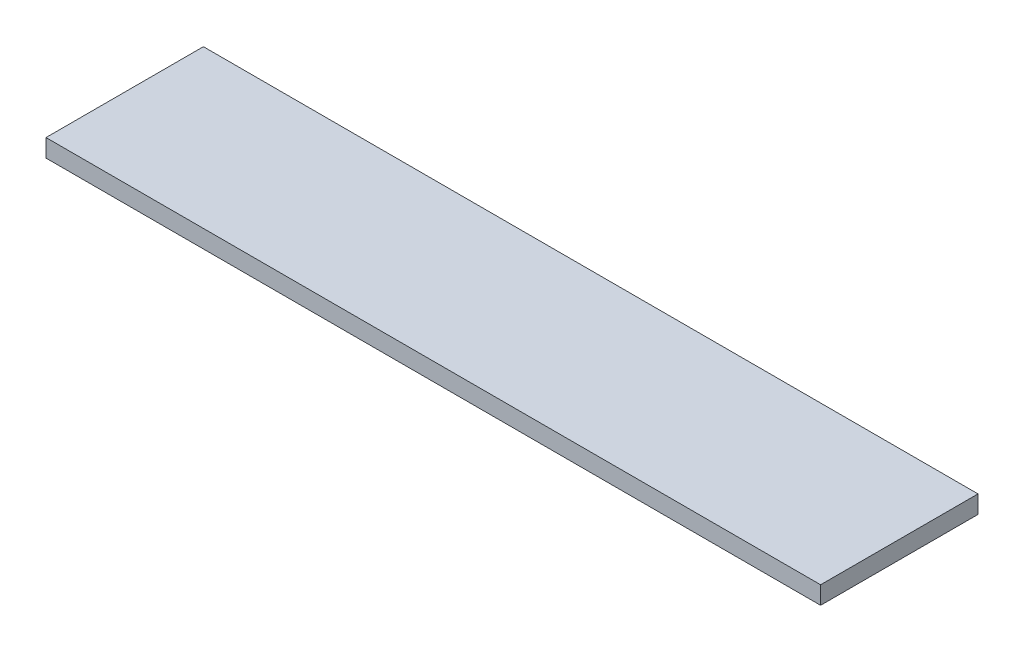
ISO-10303-21;
HEADER;
FILE_DESCRIPTION(('STEP AP214'),'2;1');
FILE_NAME('part.step','',(''),(''),'','','');
FILE_SCHEMA(('AUTOMOTIVE_DESIGN { 1 0 10303 214 1 1 1 1 }'));
ENDSEC;
DATA;
#1=APPLICATION_CONTEXT('core data for automotive mechanical design processes');
#2=APPLICATION_PROTOCOL_DEFINITION('international standard','automotive_design',2000,#1);
#3=PRODUCT_CONTEXT('',#1,'mechanical');
#4=PRODUCT('Part','Part','',(#3));
#5=PRODUCT_RELATED_PRODUCT_CATEGORY('part','',(#4));
#6=PRODUCT_DEFINITION_FORMATION('','',#4);
#7=PRODUCT_DEFINITION_CONTEXT('part definition',#1,'design');
#8=PRODUCT_DEFINITION('design','',#6,#7);
#9=PRODUCT_DEFINITION_SHAPE('','',#8);
#10=(LENGTH_UNIT() NAMED_UNIT(*) SI_UNIT(.MILLI.,.METRE.));
#11=(NAMED_UNIT(*) PLANE_ANGLE_UNIT() SI_UNIT($,.RADIAN.));
#12=(NAMED_UNIT(*) SI_UNIT($,.STERADIAN.) SOLID_ANGLE_UNIT());
#13=UNCERTAINTY_MEASURE_WITH_UNIT(LENGTH_MEASURE(1.E-05),#10,'distance_accuracy_value','');
#14=(GEOMETRIC_REPRESENTATION_CONTEXT(3) GLOBAL_UNCERTAINTY_ASSIGNED_CONTEXT((#13)) GLOBAL_UNIT_ASSIGNED_CONTEXT((#10,
#11,#12)) REPRESENTATION_CONTEXT('',''));
#15=CARTESIAN_POINT('',(0.,0.,0.));
#16=DIRECTION('',(0.,0.,1.));
#17=DIRECTION('',(1.,0.,0.));
#18=AXIS2_PLACEMENT_3D('',#15,#16,#17);
#19=CARTESIAN_POINT('',(62.5,2.875,-12.7));
#20=DIRECTION('',(-1.,0.,0.));
#21=DIRECTION('',(0.,0.,1.));
#22=AXIS2_PLACEMENT_3D('',#19,#20,#21);
#23=PLANE('',#22);
#24=DIRECTION('',(0.,0.,-1.));
#25=VECTOR('',#24,1.);
#26=CARTESIAN_POINT('',(62.5,0.,-12.7));
#27=LINE('',#26,#25);
#28=CARTESIAN_POINT('',(62.5,0.,12.7));
#29=VERTEX_POINT('',#28);
#30=CARTESIAN_POINT('',(62.5,0.,-12.7));
#31=VERTEX_POINT('',#30);
#32=EDGE_CURVE('E101',#29,#31,#27,.T.);
#33=ORIENTED_EDGE('',*,*,#32,.T.);
#34=DIRECTION('',(0.,-1.,0.));
#35=VECTOR('',#34,1.);
#36=CARTESIAN_POINT('',(62.5,2.875,-12.7));
#37=LINE('',#36,#35);
#38=CARTESIAN_POINT('',(62.5,2.875,-12.7));
#39=VERTEX_POINT('',#38);
#40=EDGE_CURVE('E11',#39,#31,#37,.T.);
#41=ORIENTED_EDGE('',*,*,#40,.F.);
#42=DIRECTION('',(0.,0.,-1.));
#43=VECTOR('',#42,1.);
#44=CARTESIAN_POINT('',(62.5,2.875,-12.7));
#45=LINE('',#44,#43);
#46=CARTESIAN_POINT('',(62.5,2.875,12.7));
#47=VERTEX_POINT('',#46);
#48=EDGE_CURVE('E88',#47,#39,#45,.T.);
#49=ORIENTED_EDGE('',*,*,#48,.F.);
#50=DIRECTION('',(0.,-1.,0.));
#51=VECTOR('',#50,1.);
#52=CARTESIAN_POINT('',(62.5,2.875,12.7));
#53=LINE('',#52,#51);
#54=EDGE_CURVE('E97',#47,#29,#53,.T.);
#55=ORIENTED_EDGE('',*,*,#54,.T.);
#56=EDGE_LOOP('',(#33,#41,#49,#55));
#57=FACE_BOUND('',#56,.T.);
#58=ADVANCED_FACE('F37',(#57),#23,.F.);
#59=CARTESIAN_POINT('',(-62.5,2.875,-12.7));
#60=DIRECTION('',(0.,0.,1.));
#61=DIRECTION('',(1.,0.,0.));
#62=AXIS2_PLACEMENT_3D('',#59,#60,#61);
#63=PLANE('',#62);
#64=DIRECTION('',(-1.,0.,0.));
#65=VECTOR('',#64,1.);
#66=CARTESIAN_POINT('',(-62.5,0.,-12.7));
#67=LINE('',#66,#65);
#68=CARTESIAN_POINT('',(-62.5,0.,-12.7));
#69=VERTEX_POINT('',#68);
#70=EDGE_CURVE('E92',#31,#69,#67,.T.);
#71=ORIENTED_EDGE('',*,*,#70,.T.);
#72=DIRECTION('',(0.,-1.,0.));
#73=VECTOR('',#72,1.);
#74=CARTESIAN_POINT('',(-62.5,2.875,-12.7));
#75=LINE('',#74,#73);
#76=CARTESIAN_POINT('',(-62.5,2.875,-12.7));
#77=VERTEX_POINT('',#76);
#78=EDGE_CURVE('E45',#77,#69,#75,.T.);
#79=ORIENTED_EDGE('',*,*,#78,.F.);
#80=DIRECTION('',(-1.,0.,0.));
#81=VECTOR('',#80,1.);
#82=CARTESIAN_POINT('',(-62.5,2.875,-12.7));
#83=LINE('',#82,#81);
#84=EDGE_CURVE('E83',#39,#77,#83,.T.);
#85=ORIENTED_EDGE('',*,*,#84,.F.);
#86=ORIENTED_EDGE('',*,*,#40,.T.);
#87=EDGE_LOOP('',(#71,#79,#85,#86));
#88=FACE_BOUND('',#87,.T.);
#89=ADVANCED_FACE('F91',(#88),#63,.F.);
#90=CARTESIAN_POINT('',(-62.5,2.875,-12.7));
#91=DIRECTION('',(1.,0.,0.));
#92=DIRECTION('',(0.,0.,-1.));
#93=AXIS2_PLACEMENT_3D('',#90,#91,#92);
#94=PLANE('',#93);
#95=DIRECTION('',(0.,0.,1.));
#96=VECTOR('',#95,1.);
#97=CARTESIAN_POINT('',(-62.5,0.,-12.7));
#98=LINE('',#97,#96);
#99=CARTESIAN_POINT('',(-62.5,0.,12.7));
#100=VERTEX_POINT('',#99);
#101=EDGE_CURVE('E70',#69,#100,#98,.T.);
#102=ORIENTED_EDGE('',*,*,#101,.T.);
#103=DIRECTION('',(0.,-1.,0.));
#104=VECTOR('',#103,1.);
#105=CARTESIAN_POINT('',(-62.5,2.875,12.7));
#106=LINE('',#105,#104);
#107=CARTESIAN_POINT('',(-62.5,2.875,12.7));
#108=VERTEX_POINT('',#107);
#109=EDGE_CURVE('E93',#108,#100,#106,.T.);
#110=ORIENTED_EDGE('',*,*,#109,.F.);
#111=DIRECTION('',(0.,0.,1.));
#112=VECTOR('',#111,1.);
#113=CARTESIAN_POINT('',(-62.5,2.875,-12.7));
#114=LINE('',#113,#112);
#115=EDGE_CURVE('E86',#77,#108,#114,.T.);
#116=ORIENTED_EDGE('',*,*,#115,.F.);
#117=ORIENTED_EDGE('',*,*,#78,.T.);
#118=EDGE_LOOP('',(#102,#110,#116,#117));
#119=FACE_BOUND('',#118,.T.);
#120=ADVANCED_FACE('F94',(#119),#94,.F.);
#121=CARTESIAN_POINT('',(-62.5,2.875,12.7));
#122=DIRECTION('',(0.,0.,-1.));
#123=DIRECTION('',(-1.,0.,0.));
#124=AXIS2_PLACEMENT_3D('',#121,#122,#123);
#125=PLANE('',#124);
#126=DIRECTION('',(1.,0.,0.));
#127=VECTOR('',#126,1.);
#128=CARTESIAN_POINT('',(-62.5,0.,12.7));
#129=LINE('',#128,#127);
#130=EDGE_CURVE('E76',#100,#29,#129,.T.);
#131=ORIENTED_EDGE('',*,*,#130,.T.);
#132=ORIENTED_EDGE('',*,*,#54,.F.);
#133=DIRECTION('',(1.,0.,0.));
#134=VECTOR('',#133,1.);
#135=CARTESIAN_POINT('',(-62.5,2.875,12.7));
#136=LINE('',#135,#134);
#137=EDGE_CURVE('E53',#108,#47,#136,.T.);
#138=ORIENTED_EDGE('',*,*,#137,.F.);
#139=ORIENTED_EDGE('',*,*,#109,.T.);
#140=EDGE_LOOP('',(#131,#132,#138,#139));
#141=FACE_BOUND('',#140,.T.);
#142=ADVANCED_FACE('F110',(#141),#125,.F.);
#143=CARTESIAN_POINT('',(0.,2.875,0.));
#144=DIRECTION('',(0.,1.,0.));
#145=DIRECTION('',(0.,0.,1.));
#146=AXIS2_PLACEMENT_3D('',#143,#144,#145);
#147=PLANE('',#146);
#148=ORIENTED_EDGE('',*,*,#48,.T.);
#149=ORIENTED_EDGE('',*,*,#84,.T.);
#150=ORIENTED_EDGE('',*,*,#115,.T.);
#151=ORIENTED_EDGE('',*,*,#137,.T.);
#152=EDGE_LOOP('',(#148,#149,#150,#151));
#153=FACE_BOUND('',#152,.T.);
#154=ADVANCED_FACE('F84',(#153),#147,.T.);
#155=CARTESIAN_POINT('',(0.,0.,0.));
#156=DIRECTION('',(0.,1.,0.));
#157=DIRECTION('',(0.,0.,1.));
#158=AXIS2_PLACEMENT_3D('',#155,#156,#157);
#159=PLANE('',#158);
#160=ORIENTED_EDGE('',*,*,#32,.F.);
#161=ORIENTED_EDGE('',*,*,#130,.F.);
#162=ORIENTED_EDGE('',*,*,#101,.F.);
#163=ORIENTED_EDGE('',*,*,#70,.F.);
#164=EDGE_LOOP('',(#160,#161,#162,#163));
#165=FACE_BOUND('',#164,.T.);
#166=ADVANCED_FACE('F113',(#165),#159,.F.);
#167=CLOSED_SHELL('',(#58,#89,#120,#142,#154,#166));
#168=MANIFOLD_SOLID_BREP('B2',#167);
#169=ADVANCED_BREP_SHAPE_REPRESENTATION('',(#18,#168),#14);
#170=SHAPE_DEFINITION_REPRESENTATION(#9,#169);
ENDSEC;
END-ISO-10303-21;
